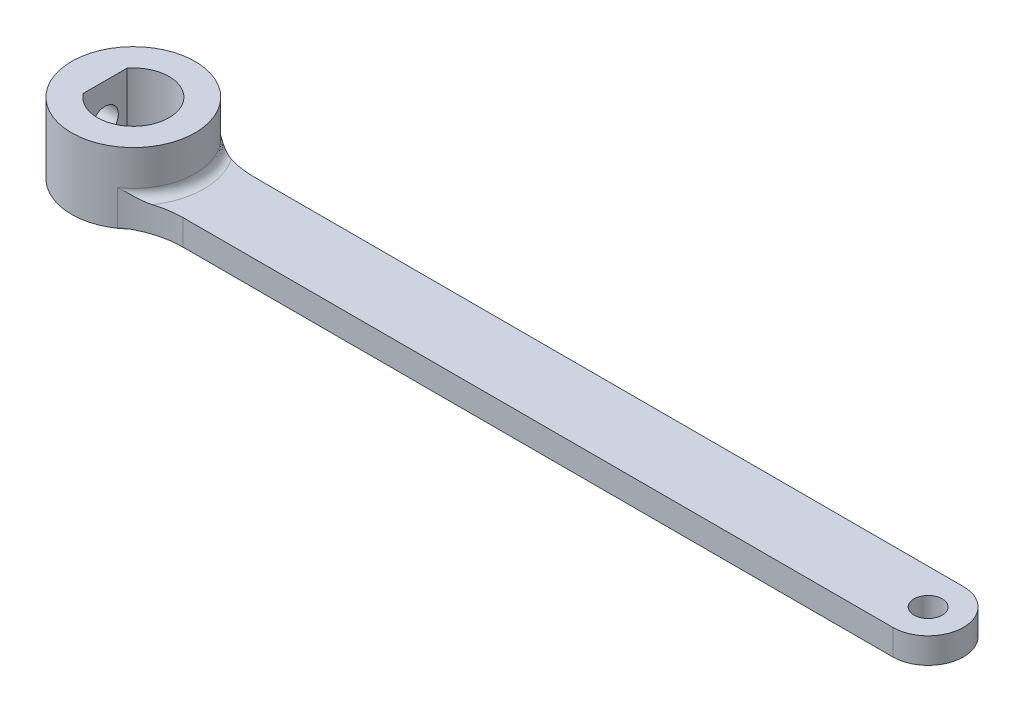
ISO-10303-21;
HEADER;
FILE_DESCRIPTION(('STEP AP214'),'2;1');
FILE_NAME('part.step','',(''),(''),'','','');
FILE_SCHEMA(('AUTOMOTIVE_DESIGN { 1 0 10303 214 1 1 1 1 }'));
ENDSEC;
DATA;
#1=APPLICATION_CONTEXT('core data for automotive mechanical design processes');
#2=APPLICATION_PROTOCOL_DEFINITION('international standard','automotive_design',2000,#1);
#3=PRODUCT_CONTEXT('',#1,'mechanical');
#4=PRODUCT('Part','Part','',(#3));
#5=PRODUCT_RELATED_PRODUCT_CATEGORY('part','',(#4));
#6=PRODUCT_DEFINITION_FORMATION('','',#4);
#7=PRODUCT_DEFINITION_CONTEXT('part definition',#1,'design');
#8=PRODUCT_DEFINITION('design','',#6,#7);
#9=PRODUCT_DEFINITION_SHAPE('','',#8);
#10=(LENGTH_UNIT() NAMED_UNIT(*) SI_UNIT(.MILLI.,.METRE.));
#11=(NAMED_UNIT(*) PLANE_ANGLE_UNIT() SI_UNIT($,.RADIAN.));
#12=(NAMED_UNIT(*) SI_UNIT($,.STERADIAN.) SOLID_ANGLE_UNIT());
#13=UNCERTAINTY_MEASURE_WITH_UNIT(LENGTH_MEASURE(1.E-05),#10,'distance_accuracy_value','');
#14=(GEOMETRIC_REPRESENTATION_CONTEXT(3) GLOBAL_UNCERTAINTY_ASSIGNED_CONTEXT((#13)) GLOBAL_UNIT_ASSIGNED_CONTEXT((#10,
#11,#12)) REPRESENTATION_CONTEXT('',''));
#15=CARTESIAN_POINT('',(0.,0.,0.));
#16=DIRECTION('',(0.,0.,1.));
#17=DIRECTION('',(1.,0.,0.));
#18=AXIS2_PLACEMENT_3D('',#15,#16,#17);
#19=CARTESIAN_POINT('',(0.,2.9,4.));
#20=DIRECTION('',(0.,0.,-1.));
#21=DIRECTION('',(-1.,0.,0.));
#22=AXIS2_PLACEMENT_3D('',#19,#20,#21);
#23=PLANE('',#22);
#24=DIRECTION('',(1.,0.,0.));
#25=VECTOR('',#24,1.);
#26=CARTESIAN_POINT('',(0.,2.9,4.));
#27=LINE('',#26,#25);
#28=CARTESIAN_POINT('',(9.64365076099295,2.9,4.));
#29=VERTEX_POINT('',#28);
#30=CARTESIAN_POINT('',(90.,2.9,4.));
#31=VERTEX_POINT('',#30);
#32=EDGE_CURVE('E175',#29,#31,#27,.T.);
#33=ORIENTED_EDGE('',*,*,#32,.F.);
#34=DIRECTION('',(0.,1.,0.));
#35=VECTOR('',#34,1.);
#36=CARTESIAN_POINT('',(9.64365076099296,0.,4.));
#37=LINE('',#36,#35);
#38=CARTESIAN_POINT('',(9.64365076099295,0.,4.));
#39=VERTEX_POINT('',#38);
#40=EDGE_CURVE('E206',#29,#39,#37,.F.);
#41=ORIENTED_EDGE('',*,*,#40,.T.);
#42=DIRECTION('',(1.,0.,0.));
#43=VECTOR('',#42,1.);
#44=CARTESIAN_POINT('',(0.,0.,4.));
#45=LINE('',#44,#43);
#46=CARTESIAN_POINT('',(90.,0.,4.));
#47=VERTEX_POINT('',#46);
#48=EDGE_CURVE('E171',#39,#47,#45,.T.);
#49=ORIENTED_EDGE('',*,*,#48,.T.);
#50=DIRECTION('',(0.,-1.,0.));
#51=VECTOR('',#50,1.);
#52=CARTESIAN_POINT('',(90.,2.9,4.));
#53=LINE('',#52,#51);
#54=EDGE_CURVE('E198',#31,#47,#53,.T.);
#55=ORIENTED_EDGE('',*,*,#54,.F.);
#56=EDGE_LOOP('',(#33,#41,#49,#55));
#57=FACE_BOUND('',#56,.T.);
#58=ADVANCED_FACE('F39',(#57),#23,.F.);
#59=CARTESIAN_POINT('',(0.,2.9,-4.));
#60=DIRECTION('',(0.,0.,1.));
#61=DIRECTION('',(1.,0.,0.));
#62=AXIS2_PLACEMENT_3D('',#59,#60,#61);
#63=PLANE('',#62);
#64=DIRECTION('',(-1.,0.,0.));
#65=VECTOR('',#64,1.);
#66=CARTESIAN_POINT('',(0.,0.,-4.));
#67=LINE('',#66,#65);
#68=CARTESIAN_POINT('',(90.,0.,-4.));
#69=VERTEX_POINT('',#68);
#70=CARTESIAN_POINT('',(9.64365076099295,0.,-4.));
#71=VERTEX_POINT('',#70);
#72=EDGE_CURVE('E179',#69,#71,#67,.T.);
#73=ORIENTED_EDGE('',*,*,#72,.T.);
#74=DIRECTION('',(0.,1.,0.));
#75=VECTOR('',#74,1.);
#76=CARTESIAN_POINT('',(9.64365076099296,2.9,-4.));
#77=LINE('',#76,#75);
#78=CARTESIAN_POINT('',(9.64365076099295,2.9,-4.));
#79=VERTEX_POINT('',#78);
#80=EDGE_CURVE('E209',#71,#79,#77,.T.);
#81=ORIENTED_EDGE('',*,*,#80,.T.);
#82=DIRECTION('',(-1.,0.,0.));
#83=VECTOR('',#82,1.);
#84=CARTESIAN_POINT('',(0.,2.9,-4.));
#85=LINE('',#84,#83);
#86=CARTESIAN_POINT('',(90.,2.9,-4.));
#87=VERTEX_POINT('',#86);
#88=EDGE_CURVE('E182',#87,#79,#85,.T.);
#89=ORIENTED_EDGE('',*,*,#88,.F.);
#90=DIRECTION('',(0.,-1.,0.));
#91=VECTOR('',#90,1.);
#92=CARTESIAN_POINT('',(90.,2.9,-4.));
#93=LINE('',#92,#91);
#94=EDGE_CURVE('E186',#87,#69,#93,.T.);
#95=ORIENTED_EDGE('',*,*,#94,.T.);
#96=EDGE_LOOP('',(#73,#81,#89,#95));
#97=FACE_BOUND('',#96,.T.);
#98=ADVANCED_FACE('F254',(#97),#63,.F.);
#99=CARTESIAN_POINT('',(0.,2.9,0.));
#100=DIRECTION('',(0.,1.,0.));
#101=DIRECTION('',(0.,0.,1.));
#102=AXIS2_PLACEMENT_3D('',#99,#100,#101);
#103=PLANE('',#102);
#104=CARTESIAN_POINT('',(9.64365076099296,2.9,-14.));
#105=DIRECTION('',(0.,1.,0.));
#106=DIRECTION('',(0.,0.,1.));
#107=AXIS2_PLACEMENT_3D('',#104,#105,#106);
#108=CIRCLE('',#107,10.);
#109=CARTESIAN_POINT('',(6.64029852493407,2.9,-4.46166286262852));
#110=VERTEX_POINT('',#109);
#111=EDGE_CURVE('E222',#79,#110,#108,.F.);
#112=ORIENTED_EDGE('',*,*,#111,.T.);
#113=CARTESIAN_POINT('',(0.,2.9,0.));
#114=DIRECTION('',(0.,1.,0.));
#115=DIRECTION('',(0.,0.,1.));
#116=AXIS2_PLACEMENT_3D('',#113,#114,#115);
#117=CIRCLE('',#116,8.);
#118=CARTESIAN_POINT('',(6.64029852493407,2.9,4.46166286262852));
#119=VERTEX_POINT('',#118);
#120=EDGE_CURVE('E226',#110,#119,#117,.F.);
#121=ORIENTED_EDGE('',*,*,#120,.T.);
#122=CARTESIAN_POINT('',(9.64365076099296,2.9,14.));
#123=DIRECTION('',(0.,1.,0.));
#124=DIRECTION('',(0.,0.,1.));
#125=AXIS2_PLACEMENT_3D('',#122,#123,#124);
#126=CIRCLE('',#125,10.);
#127=EDGE_CURVE('E212',#119,#29,#126,.F.);
#128=ORIENTED_EDGE('',*,*,#127,.T.);
#129=ORIENTED_EDGE('',*,*,#32,.T.);
#130=CARTESIAN_POINT('',(90.,2.9,0.));
#131=DIRECTION('',(0.,1.,0.));
#132=DIRECTION('',(0.,0.,1.));
#133=AXIS2_PLACEMENT_3D('',#130,#131,#132);
#134=CIRCLE('',#133,4.);
#135=EDGE_CURVE('E178',#31,#87,#134,.T.);
#136=ORIENTED_EDGE('',*,*,#135,.T.);
#137=ORIENTED_EDGE('',*,*,#88,.T.);
#138=EDGE_LOOP('',(#112,#121,#128,#129,#136,#137));
#139=FACE_BOUND('',#138,.T.);
#140=CARTESIAN_POINT('',(90.,2.9,0.));
#141=DIRECTION('',(0.,1.,0.));
#142=DIRECTION('',(0.,0.,1.));
#143=AXIS2_PLACEMENT_3D('',#140,#141,#142);
#144=CIRCLE('',#143,1.60000000000001);
#145=CARTESIAN_POINT('',(90.,2.9,1.60000000000001));
#146=VERTEX_POINT('',#145);
#147=EDGE_CURVE('E167',#146,#146,#144,.T.);
#148=ORIENTED_EDGE('',*,*,#147,.F.);
#149=EDGE_LOOP('',(#148));
#150=FACE_BOUND('',#149,.T.);
#151=ADVANCED_FACE('F259',(#139,#150),#103,.T.);
#152=CARTESIAN_POINT('',(0.,0.,0.));
#153=DIRECTION('',(0.,1.,0.));
#154=DIRECTION('',(0.,0.,1.));
#155=AXIS2_PLACEMENT_3D('',#152,#153,#154);
#156=PLANE('',#155);
#157=CARTESIAN_POINT('',(0.,0.,0.));
#158=DIRECTION('',(0.,1.,0.));
#159=DIRECTION('',(0.,0.,1.));
#160=AXIS2_PLACEMENT_3D('',#157,#158,#159);
#161=CIRCLE('',#160,7.);
#162=CARTESIAN_POINT('',(3.97091501923239,0.,-5.76470588235294));
#163=VERTEX_POINT('',#162);
#164=CARTESIAN_POINT('',(3.97091501923239,0.,5.76470588235294));
#165=VERTEX_POINT('',#164);
#166=EDGE_CURVE('E163',#163,#165,#161,.F.);
#167=ORIENTED_EDGE('',*,*,#166,.F.);
#168=CARTESIAN_POINT('',(9.64365076099296,0.,-14.));
#169=DIRECTION('',(0.,1.,0.));
#170=DIRECTION('',(0.,0.,1.));
#171=AXIS2_PLACEMENT_3D('',#168,#169,#170);
#172=CIRCLE('',#171,10.);
#173=EDGE_CURVE('E219',#163,#71,#172,.T.);
#174=ORIENTED_EDGE('',*,*,#173,.T.);
#175=ORIENTED_EDGE('',*,*,#72,.F.);
#176=CARTESIAN_POINT('',(90.,0.,0.));
#177=DIRECTION('',(0.,1.,0.));
#178=DIRECTION('',(0.,0.,1.));
#179=AXIS2_PLACEMENT_3D('',#176,#177,#178);
#180=CIRCLE('',#179,4.);
#181=EDGE_CURVE('E189',#47,#69,#180,.T.);
#182=ORIENTED_EDGE('',*,*,#181,.F.);
#183=ORIENTED_EDGE('',*,*,#48,.F.);
#184=CARTESIAN_POINT('',(9.64365076099296,0.,14.));
#185=DIRECTION('',(0.,1.,0.));
#186=DIRECTION('',(0.,0.,1.));
#187=AXIS2_PLACEMENT_3D('',#184,#185,#186);
#188=CIRCLE('',#187,10.);
#189=EDGE_CURVE('E215',#39,#165,#188,.T.);
#190=ORIENTED_EDGE('',*,*,#189,.T.);
#191=EDGE_LOOP('',(#167,#174,#175,#182,#183,#190));
#192=FACE_BOUND('',#191,.T.);
#193=CARTESIAN_POINT('',(90.,0.,0.));
#194=DIRECTION('',(0.,1.,0.));
#195=DIRECTION('',(0.,0.,1.));
#196=AXIS2_PLACEMENT_3D('',#193,#194,#195);
#197=CIRCLE('',#196,1.60000000000001);
#198=CARTESIAN_POINT('',(90.,0.,1.60000000000001));
#199=VERTEX_POINT('',#198);
#200=EDGE_CURVE('E166',#199,#199,#197,.T.);
#201=ORIENTED_EDGE('',*,*,#200,.T.);
#202=EDGE_LOOP('',(#201));
#203=FACE_BOUND('',#202,.T.);
#204=ADVANCED_FACE('F271',(#192,#203),#156,.F.);
#205=CARTESIAN_POINT('',(90.,2.9,0.));
#206=DIRECTION('',(0.,-1.,0.));
#207=DIRECTION('',(0.,0.,-1.));
#208=AXIS2_PLACEMENT_3D('',#205,#206,#207);
#209=CYLINDRICAL_SURFACE('',#208,4.);
#210=ORIENTED_EDGE('',*,*,#181,.T.);
#211=ORIENTED_EDGE('',*,*,#94,.F.);
#212=ORIENTED_EDGE('',*,*,#135,.F.);
#213=ORIENTED_EDGE('',*,*,#54,.T.);
#214=EDGE_LOOP('',(#210,#211,#212,#213));
#215=FACE_BOUND('',#214,.T.);
#216=ADVANCED_FACE('F276',(#215),#209,.T.);
#217=CARTESIAN_POINT('',(90.,2.9,0.));
#218=DIRECTION('',(0.,-1.,0.));
#219=DIRECTION('',(0.,0.,-1.));
#220=AXIS2_PLACEMENT_3D('',#217,#218,#219);
#221=CYLINDRICAL_SURFACE('',#220,1.60000000000001);
#222=ORIENTED_EDGE('',*,*,#147,.T.);
#223=EDGE_LOOP('',(#222));
#224=FACE_BOUND('',#223,.T.);
#225=ORIENTED_EDGE('',*,*,#200,.F.);
#226=EDGE_LOOP('',(#225));
#227=FACE_BOUND('',#226,.T.);
#228=ADVANCED_FACE('F287',(#224,#227),#221,.F.);
#229=CARTESIAN_POINT('',(0.,7.9,0.));
#230=DIRECTION('',(0.,-1.,0.));
#231=DIRECTION('',(0.,0.,-1.));
#232=AXIS2_PLACEMENT_3D('',#229,#230,#231);
#233=CYLINDRICAL_SURFACE('',#232,7.);
#234=CARTESIAN_POINT('',(-7.,2.4,0.));
#235=CARTESIAN_POINT('',(-6.99999846043226,2.4000028995743,-0.0832358860906148));
#236=CARTESIAN_POINT('',(-6.9985002594971,2.40695160838786,-0.166507195600273));
#237=CARTESIAN_POINT('',(-6.99266829827728,2.43453565685359,-0.330687344293325));
#238=CARTESIAN_POINT('',(-6.98833245637099,2.45518104419493,-0.411594403571188));
#239=CARTESIAN_POINT('',(-6.97730831788827,2.50948436460803,-0.568649323817735));
#240=CARTESIAN_POINT('',(-6.97062242967171,2.54312897938132,-0.644801963446554));
#241=CARTESIAN_POINT('',(-6.95562106817971,2.62243408617126,-0.790378177960786));
#242=CARTESIAN_POINT('',(-6.94730565036661,2.66809416924994,-0.859801981747368));
#243=CARTESIAN_POINT('',(-6.92981369246311,2.77088029967351,-0.991024790535228));
#244=CARTESIAN_POINT('',(-6.92062683143259,2.82815622189852,-1.05270503419445));
#245=CARTESIAN_POINT('',(-6.90250069814144,2.9522263156852,-1.16566042389435));
#246=CARTESIAN_POINT('',(-6.8935614473163,3.01902130825126,-1.21693467150908));
#247=CARTESIAN_POINT('',(-6.87684116047225,3.16110575286043,-1.30814204379808));
#248=CARTESIAN_POINT('',(-6.8690733634436,3.23647751775621,-1.34794958335009));
#249=CARTESIAN_POINT('',(-6.85572325558537,3.39303445376684,-1.41428823691147));
#250=CARTESIAN_POINT('',(-6.85014069470711,3.47421895849257,-1.44082087001716));
#251=CARTESIAN_POINT('',(-6.84189808926311,3.63881108658807,-1.47946574422454));
#252=CARTESIAN_POINT('',(-6.83919556896486,3.72216727566386,-1.49178779748342));
#253=CARTESIAN_POINT('',(-6.83689139845106,3.88980423250699,-1.50231395206577));
#254=CARTESIAN_POINT('',(-6.83728938291729,3.97408489017995,-1.50051971664629));
#255=CARTESIAN_POINT('',(-6.84110276603832,4.13962468793379,-1.48303326340861));
#256=CARTESIAN_POINT('',(-6.84446541682162,4.22091088910015,-1.46758398649408));
#257=CARTESIAN_POINT('',(-6.85374593375788,4.37971024028934,-1.42361054298677));
#258=CARTESIAN_POINT('',(-6.85966393808402,4.45722318603232,-1.39508566936466));
#259=CARTESIAN_POINT('',(-6.87344080755724,4.60696287287334,-1.32554551075991));
#260=CARTESIAN_POINT('',(-6.88131420983365,4.67914451271255,-1.2844361097283));
#261=CARTESIAN_POINT('',(-6.89810572501288,4.81567516495796,-1.19096007283993));
#262=CARTESIAN_POINT('',(-6.90702397481896,4.8800231486862,-1.13859196103562));
#263=CARTESIAN_POINT('',(-6.92512718393878,5.0004593556734,-1.0227954275532));
#264=CARTESIAN_POINT('',(-6.93431383972178,5.05634870658474,-0.959160233964411));
#265=CARTESIAN_POINT('',(-6.95175017497059,5.15669373368966,-0.823317306269098));
#266=CARTESIAN_POINT('',(-6.95999983875972,5.20114921860039,-0.751109428775401));
#267=CARTESIAN_POINT('',(-6.97465778534003,5.27741067990693,-0.59993346204996));
#268=CARTESIAN_POINT('',(-6.98106238643354,5.30919141257798,-0.520952258863484));
#269=CARTESIAN_POINT('',(-6.99128109245334,5.35897564832109,-0.358603146685707));
#270=CARTESIAN_POINT('',(-6.99509555860384,5.37698107256332,-0.27523585113367));
#271=CARTESIAN_POINT('',(-6.99965306347808,5.39841621414342,-0.10818767083663));
#272=CARTESIAN_POINT('',(-7.00045336521066,5.40211771288178,-0.0245431772716157));
#273=CARTESIAN_POINT('',(-6.99905248935969,5.39557542887484,0.142168973650404));
#274=CARTESIAN_POINT('',(-6.99685150675698,5.38533255203706,0.225236668127254));
#275=CARTESIAN_POINT('',(-6.98973143045266,5.3514177563383,0.387542537982805));
#276=CARTESIAN_POINT('',(-6.9848410504546,5.32788763052747,0.466811712908476));
#277=CARTESIAN_POINT('',(-6.9728892442151,5.26822305700518,0.620278450473417));
#278=CARTESIAN_POINT('',(-6.96582763822237,5.23208756568835,0.694475592587739));
#279=CARTESIAN_POINT('',(-6.950175043904,5.14766645693967,0.836821397964753));
#280=CARTESIAN_POINT('',(-6.94156431354275,5.09922020509027,0.90487257511114));
#281=CARTESIAN_POINT('',(-6.92381033034847,4.99176517511126,1.0319769255236));
#282=CARTESIAN_POINT('',(-6.91466701142097,4.93275508411256,1.091028978692));
#283=CARTESIAN_POINT('',(-6.89668172706324,4.80460262981287,1.19952711057989));
#284=CARTESIAN_POINT('',(-6.88784792221285,4.7352999007779,1.24878537255156));
#285=CARTESIAN_POINT('',(-6.87166654559681,4.58924540352201,1.3349641538604));
#286=CARTESIAN_POINT('',(-6.86431891048055,4.51249395302251,1.37188519913706));
#287=CARTESIAN_POINT('',(-6.8520100980739,4.3541277010054,1.43209741248548));
#288=CARTESIAN_POINT('',(-6.84703574582967,4.27254264356933,1.45546398641275));
#289=CARTESIAN_POINT('',(-6.84001186708418,4.10648441616636,1.48812696085335));
#290=CARTESIAN_POINT('',(-6.83796189439706,4.02201168879868,1.49742550780258));
#291=CARTESIAN_POINT('',(-6.83704618848155,3.85446765682476,1.5015999992604));
#292=CARTESIAN_POINT('',(-6.83811476518543,3.77140398501942,1.49677347258311));
#293=CARTESIAN_POINT('',(-6.8431676318483,3.60730275786741,1.47349789406331));
#294=CARTESIAN_POINT('',(-6.84715189026714,3.52626518061343,1.45504898957979));
#295=CARTESIAN_POINT('',(-6.85755581104157,3.36874134213083,1.40519345940434));
#296=CARTESIAN_POINT('',(-6.86396764224703,3.29224135133571,1.37382847170887));
#297=CARTESIAN_POINT('',(-6.87850764590649,3.14554462749315,1.29906751595601));
#298=CARTESIAN_POINT('',(-6.88663598880363,3.07534852138496,1.255670353015));
#299=CARTESIAN_POINT('',(-6.90389055593232,2.94178180627464,1.15708290349304));
#300=CARTESIAN_POINT('',(-6.91303309938926,2.87857030405302,1.10167987421237));
#301=CARTESIAN_POINT('',(-6.93117449799694,2.76224373747954,0.981086554619622));
#302=CARTESIAN_POINT('',(-6.94017331951296,2.7091310056878,0.915894009385598));
#303=CARTESIAN_POINT('',(-6.95714491048987,2.61388404049444,0.776603147268718));
#304=CARTESIAN_POINT('',(-6.96510364570626,2.57189339376902,0.702404846009642));
#305=CARTESIAN_POINT('',(-6.97895826104019,2.50104547109382,0.547850160940599));
#306=CARTESIAN_POINT('',(-6.98485590212343,2.47217697741497,0.467499105863881));
#307=CARTESIAN_POINT('',(-6.99284848461772,2.43364781486885,0.322535217553206));
#308=CARTESIAN_POINT('',(-6.99551391888263,2.42105356601997,0.258717205545982));
#309=CARTESIAN_POINT('',(-6.99909024154719,2.40422869828833,0.129939960853849));
#310=CARTESIAN_POINT('',(-7.00000120191314,2.39999773635394,0.0649807750887471));
#311=CARTESIAN_POINT('',(-7.,2.4,0.));
#312=B_SPLINE_CURVE_WITH_KNOTS('',3,(#234,#235,#236,#237,#238,#239,#240,#241,#242,#243,#244,
#245,#246,#247,#248,#249,#250,#251,#252,#253,#254,#255,#256,#257,#258,#259,#260,#261,#262,#263,
#264,#265,#266,#267,#268,#269,#270,#271,#272,#273,#274,#275,#276,#277,#278,#279,#280,#281,#282,
#283,#284,#285,#286,#287,#288,#289,#290,#291,#292,#293,#294,#295,#296,#297,#298,#299,#300,#301,
#302,#303,#304,#305,#306,#307,#308,#309,#310,#311),.UNSPECIFIED.,.T.,.F.,(4,2,2,2,2,2,2,2,2,2,2,
2,2,2,2,2,2,2,2,2,2,2,2,2,2,2,2,2,2,2,2,2,2,2,2,2,2,2,4),(0.,0.249469836512082,
0.499122883219936,0.748520824425602,0.997910278645887,1.25074961881732,1.50361077918506,
1.7591442921451,2.0146485567749,2.26633008124666,2.51798195169165,2.76524475452928,
3.01252092904568,3.26169356165968,3.51089887920889,3.76527011050291,4.0196455970235,
4.27452521139806,4.52936927256343,4.77934665704185,5.02930780231429,5.27665060589267,
5.52401389198434,5.77478733867803,6.02559197304485,6.28082063283534,6.53603841075805,
6.78982240408475,7.04356767229185,7.29200680540294,7.5404432510827,7.78808499706785,
8.03575134451623,8.28822950154114,8.54076590397115,8.79641910357222,9.0518533401027,
9.24661799132293,9.44137465337336),.UNSPECIFIED.);
#313=CARTESIAN_POINT('',(-7.,2.4,0.));
#314=VERTEX_POINT('',#313);
#315=EDGE_CURVE('E143',#314,#314,#312,.T.);
#316=ORIENTED_EDGE('',*,*,#315,.T.);
#317=EDGE_LOOP('',(#316));
#318=FACE_BOUND('',#317,.T.);
#319=CARTESIAN_POINT('',(0.,7.9,0.));
#320=DIRECTION('',(0.,1.,0.));
#321=DIRECTION('',(0.,0.,1.));
#322=AXIS2_PLACEMENT_3D('',#319,#320,#321);
#323=CIRCLE('',#322,7.);
#324=CARTESIAN_POINT('',(0.,7.9,7.));
#325=VERTEX_POINT('',#324);
#326=EDGE_CURVE('E159',#325,#325,#323,.T.);
#327=ORIENTED_EDGE('',*,*,#326,.F.);
#328=EDGE_LOOP('',(#327));
#329=FACE_BOUND('',#328,.T.);
#330=CARTESIAN_POINT('',(0.,-0.1,0.));
#331=DIRECTION('',(0.,1.,0.));
#332=DIRECTION('',(0.,0.,1.));
#333=AXIS2_PLACEMENT_3D('',#330,#331,#332);
#334=CIRCLE('',#333,7.);
#335=CARTESIAN_POINT('',(0.,-0.1,7.));
#336=VERTEX_POINT('',#335);
#337=EDGE_CURVE('E154',#336,#336,#334,.T.);
#338=ORIENTED_EDGE('',*,*,#337,.T.);
#339=EDGE_LOOP('',(#338));
#340=FACE_BOUND('',#339,.T.);
#341=DIRECTION('',(0.,-1.,0.));
#342=VECTOR('',#341,1.);
#343=CARTESIAN_POINT('',(3.97091501923239,7.9,5.76470588235294));
#344=LINE('',#343,#342);
#345=CARTESIAN_POINT('',(3.97091501923239,3.9,5.76470588235294));
#346=VERTEX_POINT('',#345);
#347=EDGE_CURVE('E60',#165,#346,#344,.F.);
#348=ORIENTED_EDGE('',*,*,#347,.T.);
#349=CARTESIAN_POINT('',(0.,3.9,0.));
#350=DIRECTION('',(0.,1.,0.));
#351=DIRECTION('',(0.,0.,1.));
#352=AXIS2_PLACEMENT_3D('',#349,#350,#351);
#353=CIRCLE('',#352,7.);
#354=CARTESIAN_POINT('',(3.97091501923239,3.9,-5.76470588235294));
#355=VERTEX_POINT('',#354);
#356=EDGE_CURVE('E230',#346,#355,#353,.T.);
#357=ORIENTED_EDGE('',*,*,#356,.T.);
#358=DIRECTION('',(0.,-1.,0.));
#359=VECTOR('',#358,1.);
#360=CARTESIAN_POINT('',(3.97091501923239,7.9,-5.76470588235294));
#361=LINE('',#360,#359);
#362=EDGE_CURVE('E67',#355,#163,#361,.T.);
#363=ORIENTED_EDGE('',*,*,#362,.T.);
#364=ORIENTED_EDGE('',*,*,#166,.T.);
#365=EDGE_LOOP('',(#348,#357,#363,#364));
#366=FACE_BOUND('',#365,.T.);
#367=ADVANCED_FACE('F284',(#318,#329,#340,#366),#233,.T.);
#368=CARTESIAN_POINT('',(0.,7.9,0.));
#369=DIRECTION('',(0.,1.,0.));
#370=DIRECTION('',(0.,0.,1.));
#371=AXIS2_PLACEMENT_3D('',#368,#369,#370);
#372=PLANE('',#371);
#373=CARTESIAN_POINT('',(0.,7.9,0.));
#374=DIRECTION('',(0.,1.,0.));
#375=DIRECTION('',(0.,0.,1.));
#376=AXIS2_PLACEMENT_3D('',#373,#374,#375);
#377=CIRCLE('',#376,4.05);
#378=CARTESIAN_POINT('',(-3.2,7.9,2.48243831746128));
#379=VERTEX_POINT('',#378);
#380=CARTESIAN_POINT('',(-3.2,7.9,-2.48243831746128));
#381=VERTEX_POINT('',#380);
#382=EDGE_CURVE('E122',#379,#381,#377,.T.);
#383=ORIENTED_EDGE('',*,*,#382,.F.);
#384=DIRECTION('',(0.,0.,1.));
#385=VECTOR('',#384,1.);
#386=CARTESIAN_POINT('',(-3.2,7.9,-2.48243831746128));
#387=LINE('',#386,#385);
#388=EDGE_CURVE('E138',#381,#379,#387,.T.);
#389=ORIENTED_EDGE('',*,*,#388,.F.);
#390=EDGE_LOOP('',(#383,#389));
#391=FACE_BOUND('',#390,.T.);
#392=ORIENTED_EDGE('',*,*,#326,.T.);
#393=EDGE_LOOP('',(#392));
#394=FACE_BOUND('',#393,.T.);
#395=ADVANCED_FACE('F286',(#391,#394),#372,.T.);
#396=CARTESIAN_POINT('',(0.,-0.1,0.));
#397=DIRECTION('',(0.,1.,0.));
#398=DIRECTION('',(0.,0.,1.));
#399=AXIS2_PLACEMENT_3D('',#396,#397,#398);
#400=PLANE('',#399);
#401=DIRECTION('',(0.,0.,1.));
#402=VECTOR('',#401,1.);
#403=CARTESIAN_POINT('',(-3.2,-0.0999999999999994,-2.48243831746128));
#404=LINE('',#403,#402);
#405=CARTESIAN_POINT('',(-3.2,-0.0999999999999994,-2.48243831746128));
#406=VERTEX_POINT('',#405);
#407=CARTESIAN_POINT('',(-3.2,-0.1,2.48243831746128));
#408=VERTEX_POINT('',#407);
#409=EDGE_CURVE('E128',#406,#408,#404,.T.);
#410=ORIENTED_EDGE('',*,*,#409,.T.);
#411=CARTESIAN_POINT('',(0.,-0.0999999999999994,0.));
#412=DIRECTION('',(0.,1.,0.));
#413=DIRECTION('',(0.,0.,1.));
#414=AXIS2_PLACEMENT_3D('',#411,#412,#413);
#415=CIRCLE('',#414,4.05);
#416=EDGE_CURVE('E119',#408,#406,#415,.T.);
#417=ORIENTED_EDGE('',*,*,#416,.T.);
#418=EDGE_LOOP('',(#410,#417));
#419=FACE_BOUND('',#418,.T.);
#420=ORIENTED_EDGE('',*,*,#337,.F.);
#421=EDGE_LOOP('',(#420));
#422=FACE_BOUND('',#421,.T.);
#423=ADVANCED_FACE('F135',(#419,#422),#400,.F.);
#424=CARTESIAN_POINT('',(0.,-0.0999999999999994,0.));
#425=DIRECTION('',(0.,1.,0.));
#426=DIRECTION('',(0.,0.,1.));
#427=AXIS2_PLACEMENT_3D('',#424,#425,#426);
#428=CYLINDRICAL_SURFACE('',#427,4.05);
#429=ORIENTED_EDGE('',*,*,#382,.T.);
#430=DIRECTION('',(0.,1.,0.));
#431=VECTOR('',#430,1.);
#432=CARTESIAN_POINT('',(-3.2,-0.0999999999999994,-2.48243831746128));
#433=LINE('',#432,#431);
#434=EDGE_CURVE('E115',#406,#381,#433,.T.);
#435=ORIENTED_EDGE('',*,*,#434,.F.);
#436=ORIENTED_EDGE('',*,*,#416,.F.);
#437=DIRECTION('',(0.,1.,0.));
#438=VECTOR('',#437,1.);
#439=CARTESIAN_POINT('',(-3.2,-0.0999999999999994,2.48243831746128));
#440=LINE('',#439,#438);
#441=EDGE_CURVE('E127',#408,#379,#440,.T.);
#442=ORIENTED_EDGE('',*,*,#441,.T.);
#443=EDGE_LOOP('',(#429,#435,#436,#442));
#444=FACE_BOUND('',#443,.T.);
#445=ADVANCED_FACE('F117',(#444),#428,.F.);
#446=CARTESIAN_POINT('',(-3.2,-0.0999999999999994,-2.48243831746128));
#447=DIRECTION('',(-1.,0.,0.));
#448=DIRECTION('',(0.,0.,1.));
#449=AXIS2_PLACEMENT_3D('',#446,#447,#448);
#450=PLANE('',#449);
#451=CARTESIAN_POINT('',(-3.2,3.9,0.));
#452=DIRECTION('',(1.,0.,0.));
#453=DIRECTION('',(0.,0.,-1.));
#454=AXIS2_PLACEMENT_3D('',#451,#452,#453);
#455=CIRCLE('',#454,1.5);
#456=CARTESIAN_POINT('',(-3.2,3.9,-1.5));
#457=VERTEX_POINT('',#456);
#458=EDGE_CURVE('E402',#457,#457,#455,.T.);
#459=ORIENTED_EDGE('',*,*,#458,.F.);
#460=EDGE_LOOP('',(#459));
#461=FACE_BOUND('',#460,.T.);
#462=ORIENTED_EDGE('',*,*,#388,.T.);
#463=ORIENTED_EDGE('',*,*,#441,.F.);
#464=ORIENTED_EDGE('',*,*,#409,.F.);
#465=ORIENTED_EDGE('',*,*,#434,.T.);
#466=EDGE_LOOP('',(#462,#463,#464,#465));
#467=FACE_BOUND('',#466,.T.);
#468=ADVANCED_FACE('F131',(#461,#467),#450,.F.);
#469=CARTESIAN_POINT('',(-7.,3.9,0.));
#470=DIRECTION('',(1.,0.,0.));
#471=DIRECTION('',(0.,0.,-1.));
#472=AXIS2_PLACEMENT_3D('',#469,#470,#471);
#473=CYLINDRICAL_SURFACE('',#472,1.5);
#474=ORIENTED_EDGE('',*,*,#458,.T.);
#475=EDGE_LOOP('',(#474));
#476=FACE_BOUND('',#475,.T.);
#477=ORIENTED_EDGE('',*,*,#315,.F.);
#478=EDGE_LOOP('',(#477));
#479=FACE_BOUND('',#478,.T.);
#480=ADVANCED_FACE('F243',(#476,#479),#473,.F.);
#481=CARTESIAN_POINT('',(9.64365076099296,7.9,14.));
#482=DIRECTION('',(0.,-1.,0.));
#483=DIRECTION('',(0.,0.,-1.));
#484=AXIS2_PLACEMENT_3D('',#481,#482,#483);
#485=CYLINDRICAL_SURFACE('',#484,10.);
#486=ORIENTED_EDGE('',*,*,#189,.F.);
#487=ORIENTED_EDGE('',*,*,#40,.F.);
#488=ORIENTED_EDGE('',*,*,#127,.F.);
#489=CARTESIAN_POINT('',(6.64029852493407,2.9,4.46166286262852));
#490=CARTESIAN_POINT('',(6.56125744411581,2.90003993141161,4.4865435427421));
#491=CARTESIAN_POINT('',(6.48263410990684,2.90400904111719,4.51238638059971));
#492=CARTESIAN_POINT('',(6.326766820218,2.91860270532806,4.56575313672567));
#493=CARTESIAN_POINT('',(6.24952016443678,2.92921229926779,4.59327315096565));
#494=CARTESIAN_POINT('',(6.09738300739369,2.95575684656952,4.64957165042591));
#495=CARTESIAN_POINT('',(6.02247639816541,2.97163557066253,4.67833417061072));
#496=CARTESIAN_POINT('',(5.87427287755348,3.00786047996514,4.73727082995391));
#497=CARTESIAN_POINT('',(5.80097708175247,3.02820966023958,4.7674459047629));
#498=CARTESIAN_POINT('',(5.56874609121619,3.09932604177595,4.86625430723956));
#499=CARTESIAN_POINT('',(5.41305390413124,3.15719715683661,4.93741066642307));
#500=CARTESIAN_POINT('',(5.10933929033788,3.28449962358436,5.08548216593872));
#501=CARTESIAN_POINT('',(4.96132485440881,3.35394271458535,5.16240311016146));
#502=CARTESIAN_POINT('',(4.67124997524843,3.50018595888868,5.32228207318084));
#503=CARTESIAN_POINT('',(4.529223525635,3.57702162941345,5.40526872423675));
#504=CARTESIAN_POINT('',(4.25084154958714,3.73400689983852,5.57715265081086));
#505=CARTESIAN_POINT('',(4.11448302501139,3.81415470181036,5.66604673512087));
#506=CARTESIAN_POINT('',(3.97723648169709,3.89621794959417,5.76035414554773));
#507=CARTESIAN_POINT('',(3.97407512114975,3.89810897883894,5.76252911089113));
#508=CARTESIAN_POINT('',(3.97091501923239,3.9,5.76470588235294));
#509=B_SPLINE_CURVE_WITH_KNOTS('',3,(#489,#490,#491,#492,#493,#494,#495,#496,#497,#498,#499,
#500,#501,#502,#503,#504,#505,#506,#507,#508),.UNSPECIFIED.,.F.,.F.,(4,2,2,2,2,2,2,2,2,4),(0.,
0.248338874095127,0.496120261372847,0.741338216257435,0.986720963207804,1.52781999699019,
2.06947133396863,2.61386900151937,3.15797493800176,3.1708087186707),.UNSPECIFIED.);
#510=EDGE_CURVE('E53',#119,#346,#509,.T.);
#511=ORIENTED_EDGE('',*,*,#510,.T.);
#512=ORIENTED_EDGE('',*,*,#347,.F.);
#513=EDGE_LOOP('',(#486,#487,#488,#511,#512));
#514=FACE_BOUND('',#513,.T.);
#515=ADVANCED_FACE('F238',(#514),#485,.F.);
#516=CARTESIAN_POINT('',(9.64365076099296,7.9,-14.));
#517=DIRECTION('',(0.,-1.,0.));
#518=DIRECTION('',(0.,0.,-1.));
#519=AXIS2_PLACEMENT_3D('',#516,#517,#518);
#520=CYLINDRICAL_SURFACE('',#519,10.);
#521=ORIENTED_EDGE('',*,*,#111,.F.);
#522=ORIENTED_EDGE('',*,*,#80,.F.);
#523=ORIENTED_EDGE('',*,*,#173,.F.);
#524=ORIENTED_EDGE('',*,*,#362,.F.);
#525=CARTESIAN_POINT('',(6.64029852493407,2.9,-4.46166286262852));
#526=CARTESIAN_POINT('',(6.56125744411581,2.90003993141161,-4.4865435427421));
#527=CARTESIAN_POINT('',(6.48263410990684,2.90400904111719,-4.51238638059971));
#528=CARTESIAN_POINT('',(6.326766820218,2.91860270532806,-4.56575313672567));
#529=CARTESIAN_POINT('',(6.24952016443678,2.92921229926779,-4.59327315096565));
#530=CARTESIAN_POINT('',(6.09738300739369,2.95575684656952,-4.64957165042591));
#531=CARTESIAN_POINT('',(6.02247639816541,2.97163557066253,-4.67833417061072));
#532=CARTESIAN_POINT('',(5.87427287755348,3.00786047996514,-4.73727082995391));
#533=CARTESIAN_POINT('',(5.80097708175247,3.02820966023958,-4.7674459047629));
#534=CARTESIAN_POINT('',(5.56874609121619,3.09932604177595,-4.86625430723956));
#535=CARTESIAN_POINT('',(5.41305390413124,3.15719715683661,-4.93741066642307));
#536=CARTESIAN_POINT('',(5.10933929033788,3.28449962358436,-5.08548216593872));
#537=CARTESIAN_POINT('',(4.96132485440881,3.35394271458535,-5.16240311016146));
#538=CARTESIAN_POINT('',(4.67124997524843,3.50018595888868,-5.32228207318084));
#539=CARTESIAN_POINT('',(4.529223525635,3.57702162941345,-5.40526872423675));
#540=CARTESIAN_POINT('',(4.25084154958714,3.73400689983852,-5.57715265081086));
#541=CARTESIAN_POINT('',(4.11448302501139,3.81415470181036,-5.66604673512087));
#542=CARTESIAN_POINT('',(3.97723648169709,3.89621794959417,-5.76035414554773));
#543=CARTESIAN_POINT('',(3.97407512114975,3.89810897883894,-5.76252911089113));
#544=CARTESIAN_POINT('',(3.97091501923239,3.9,-5.76470588235294));
#545=B_SPLINE_CURVE_WITH_KNOTS('',3,(#525,#526,#527,#528,#529,#530,#531,#532,#533,#534,#535,
#536,#537,#538,#539,#540,#541,#542,#543,#544),.UNSPECIFIED.,.F.,.F.,(4,2,2,2,2,2,2,2,2,4),(0.,
0.248338874095127,0.496120261372847,0.741338216257435,0.986720963207804,1.52781999699019,
2.06947133396863,2.61386900151937,3.15797493800176,3.1708087186707),.UNSPECIFIED.);
#546=EDGE_CURVE('E11',#355,#110,#545,.F.);
#547=ORIENTED_EDGE('',*,*,#546,.T.);
#548=EDGE_LOOP('',(#521,#522,#523,#524,#547));
#549=FACE_BOUND('',#548,.T.);
#550=ADVANCED_FACE('F242',(#549),#520,.F.);
#551=CARTESIAN_POINT('',(0.,3.9,0.));
#552=DIRECTION('',(0.,1.,0.));
#553=DIRECTION('',(0.,0.,1.));
#554=AXIS2_PLACEMENT_3D('',#551,#552,#553);
#555=TOROIDAL_SURFACE('',#554,8.,1.);
#556=ORIENTED_EDGE('',*,*,#546,.F.);
#557=ORIENTED_EDGE('',*,*,#356,.F.);
#558=ORIENTED_EDGE('',*,*,#510,.F.);
#559=ORIENTED_EDGE('',*,*,#120,.F.);
#560=EDGE_LOOP('',(#556,#557,#558,#559));
#561=FACE_BOUND('',#560,.T.);
#562=ADVANCED_FACE('F41',(#561),#555,.F.);
#563=CLOSED_SHELL('',(#58,#98,#151,#204,#216,#228,#367,#395,#423,#445,#468,#480,#515,#550,#562));
#564=MANIFOLD_SOLID_BREP('B2',#563);
#565=ADVANCED_BREP_SHAPE_REPRESENTATION('',(#18,#564),#14);
#566=SHAPE_DEFINITION_REPRESENTATION(#9,#565);
ENDSEC;
END-ISO-10303-21;
